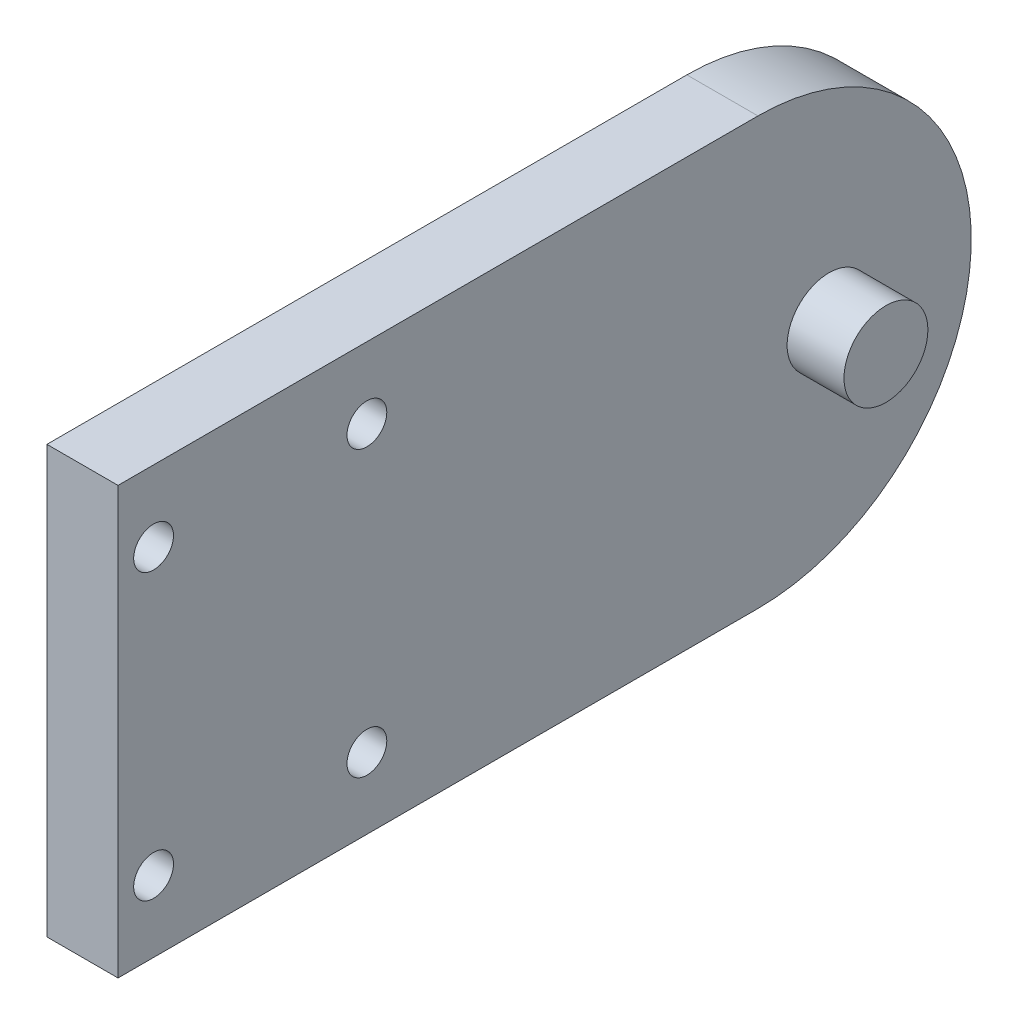
ISO-10303-21;
HEADER;
FILE_DESCRIPTION(('STEP AP214'),'2;1');
FILE_NAME('part.step','',(''),(''),'','','');
FILE_SCHEMA(('AUTOMOTIVE_DESIGN { 1 0 10303 214 1 1 1 1 }'));
ENDSEC;
DATA;
#1=APPLICATION_CONTEXT('core data for automotive mechanical design processes');
#2=APPLICATION_PROTOCOL_DEFINITION('international standard','automotive_design',2000,#1);
#3=PRODUCT_CONTEXT('',#1,'mechanical');
#4=PRODUCT('Part','Part','',(#3));
#5=PRODUCT_RELATED_PRODUCT_CATEGORY('part','',(#4));
#6=PRODUCT_DEFINITION_FORMATION('','',#4);
#7=PRODUCT_DEFINITION_CONTEXT('part definition',#1,'design');
#8=PRODUCT_DEFINITION('design','',#6,#7);
#9=PRODUCT_DEFINITION_SHAPE('','',#8);
#10=(LENGTH_UNIT() NAMED_UNIT(*) SI_UNIT(.MILLI.,.METRE.));
#11=(NAMED_UNIT(*) PLANE_ANGLE_UNIT() SI_UNIT($,.RADIAN.));
#12=(NAMED_UNIT(*) SI_UNIT($,.STERADIAN.) SOLID_ANGLE_UNIT());
#13=UNCERTAINTY_MEASURE_WITH_UNIT(LENGTH_MEASURE(1.E-05),#10,'distance_accuracy_value','');
#14=(GEOMETRIC_REPRESENTATION_CONTEXT(3) GLOBAL_UNCERTAINTY_ASSIGNED_CONTEXT((#13)) GLOBAL_UNIT_ASSIGNED_CONTEXT((#10,
#11,#12)) REPRESENTATION_CONTEXT('',''));
#15=CARTESIAN_POINT('',(0.,0.,0.));
#16=DIRECTION('',(0.,0.,1.));
#17=DIRECTION('',(1.,0.,0.));
#18=AXIS2_PLACEMENT_3D('',#15,#16,#17);
#19=CARTESIAN_POINT('',(0.,30.,0.));
#20=DIRECTION('',(0.,1.,0.));
#21=DIRECTION('',(0.,0.,-1.));
#22=AXIS2_PLACEMENT_3D('',#19,#20,#21);
#23=PLANE('',#22);
#24=DIRECTION('',(0.,0.,-1.));
#25=VECTOR('',#24,1.);
#26=CARTESIAN_POINT('',(-2.5,30.,30.));
#27=LINE('',#26,#25);
#28=CARTESIAN_POINT('',(-2.5,30.,30.));
#29=VERTEX_POINT('',#28);
#30=CARTESIAN_POINT('',(-2.5,30.,-15.));
#31=VERTEX_POINT('',#30);
#32=EDGE_CURVE('E85',#29,#31,#27,.T.);
#33=ORIENTED_EDGE('',*,*,#32,.F.);
#34=DIRECTION('',(-1.,0.,0.));
#35=VECTOR('',#34,1.);
#36=CARTESIAN_POINT('',(-2.5,30.,30.));
#37=LINE('',#36,#35);
#38=CARTESIAN_POINT('',(2.5,30.,30.));
#39=VERTEX_POINT('',#38);
#40=EDGE_CURVE('E89',#39,#29,#37,.T.);
#41=ORIENTED_EDGE('',*,*,#40,.F.);
#42=DIRECTION('',(0.,0.,1.));
#43=VECTOR('',#42,1.);
#44=CARTESIAN_POINT('',(2.5,30.,30.));
#45=LINE('',#44,#43);
#46=CARTESIAN_POINT('',(2.5,30.,-15.));
#47=VERTEX_POINT('',#46);
#48=EDGE_CURVE('E188',#47,#39,#45,.T.);
#49=ORIENTED_EDGE('',*,*,#48,.F.);
#50=DIRECTION('',(-1.,0.,0.));
#51=VECTOR('',#50,1.);
#52=CARTESIAN_POINT('',(7.5,30.,-15.));
#53=LINE('',#52,#51);
#54=EDGE_CURVE('E11',#31,#47,#53,.F.);
#55=ORIENTED_EDGE('',*,*,#54,.F.);
#56=EDGE_LOOP('',(#33,#41,#49,#55));
#57=FACE_BOUND('',#56,.T.);
#58=ADVANCED_FACE('F41',(#57),#23,.T.);
#59=CARTESIAN_POINT('',(-2.5,30.,30.));
#60=DIRECTION('',(1.,0.,0.));
#61=DIRECTION('',(0.,0.,1.));
#62=AXIS2_PLACEMENT_3D('',#59,#60,#61);
#63=PLANE('',#62);
#64=CARTESIAN_POINT('',(-2.5,25.,27.5));
#65=DIRECTION('',(1.,0.,0.));
#66=DIRECTION('',(0.,0.,-1.));
#67=AXIS2_PLACEMENT_3D('',#64,#65,#66);
#68=CIRCLE('',#67,1.4);
#69=CARTESIAN_POINT('',(-2.5,25.,26.1));
#70=VERTEX_POINT('',#69);
#71=EDGE_CURVE('E109',#70,#70,#68,.T.);
#72=ORIENTED_EDGE('',*,*,#71,.T.);
#73=EDGE_LOOP('',(#72));
#74=FACE_BOUND('',#73,.T.);
#75=CARTESIAN_POINT('',(-2.5,25.,12.5));
#76=DIRECTION('',(1.,0.,0.));
#77=DIRECTION('',(0.,0.,-1.));
#78=AXIS2_PLACEMENT_3D('',#75,#76,#77);
#79=CIRCLE('',#78,1.4);
#80=CARTESIAN_POINT('',(-2.5,25.,11.1));
#81=VERTEX_POINT('',#80);
#82=EDGE_CURVE('E176',#81,#81,#79,.T.);
#83=ORIENTED_EDGE('',*,*,#82,.T.);
#84=EDGE_LOOP('',(#83));
#85=FACE_BOUND('',#84,.T.);
#86=CARTESIAN_POINT('',(-2.5,5.,12.5));
#87=DIRECTION('',(1.,0.,0.));
#88=DIRECTION('',(0.,0.,1.));
#89=AXIS2_PLACEMENT_3D('',#86,#87,#88);
#90=CIRCLE('',#89,1.4);
#91=CARTESIAN_POINT('',(-2.5,5.,13.9));
#92=VERTEX_POINT('',#91);
#93=EDGE_CURVE('E174',#92,#92,#90,.T.);
#94=ORIENTED_EDGE('',*,*,#93,.T.);
#95=EDGE_LOOP('',(#94));
#96=FACE_BOUND('',#95,.T.);
#97=CARTESIAN_POINT('',(-2.5,5.,27.5));
#98=DIRECTION('',(1.,0.,0.));
#99=DIRECTION('',(0.,0.,1.));
#100=AXIS2_PLACEMENT_3D('',#97,#98,#99);
#101=CIRCLE('',#100,1.4);
#102=CARTESIAN_POINT('',(-2.5,5.,28.9));
#103=VERTEX_POINT('',#102);
#104=EDGE_CURVE('E177',#103,#103,#101,.T.);
#105=ORIENTED_EDGE('',*,*,#104,.T.);
#106=EDGE_LOOP('',(#105));
#107=FACE_BOUND('',#106,.T.);
#108=CARTESIAN_POINT('',(-2.5,15.,-15.));
#109=DIRECTION('',(1.,0.,0.));
#110=DIRECTION('',(0.,0.,-1.));
#111=AXIS2_PLACEMENT_3D('',#108,#109,#110);
#112=CIRCLE('',#111,15.);
#113=CARTESIAN_POINT('',(-2.5,0.,-15.));
#114=VERTEX_POINT('',#113);
#115=EDGE_CURVE('E93',#114,#31,#112,.T.);
#116=ORIENTED_EDGE('',*,*,#115,.F.);
#117=DIRECTION('',(0.,0.,-1.));
#118=VECTOR('',#117,1.);
#119=CARTESIAN_POINT('',(-2.5,0.,30.));
#120=LINE('',#119,#118);
#121=CARTESIAN_POINT('',(-2.5,0.,30.));
#122=VERTEX_POINT('',#121);
#123=EDGE_CURVE('E79',#122,#114,#120,.T.);
#124=ORIENTED_EDGE('',*,*,#123,.F.);
#125=DIRECTION('',(0.,-1.,0.));
#126=VECTOR('',#125,1.);
#127=CARTESIAN_POINT('',(-2.5,30.,30.));
#128=LINE('',#127,#126);
#129=EDGE_CURVE('E64',#29,#122,#128,.T.);
#130=ORIENTED_EDGE('',*,*,#129,.F.);
#131=ORIENTED_EDGE('',*,*,#32,.T.);
#132=EDGE_LOOP('',(#116,#124,#130,#131));
#133=FACE_BOUND('',#132,.T.);
#134=ADVANCED_FACE('F43',(#74,#85,#96,#107,#133),#63,.F.);
#135=CARTESIAN_POINT('',(2.5,30.,30.));
#136=DIRECTION('',(-1.,0.,0.));
#137=DIRECTION('',(0.,0.,-1.));
#138=AXIS2_PLACEMENT_3D('',#135,#136,#137);
#139=PLANE('',#138);
#140=CARTESIAN_POINT('',(2.5,25.,27.5));
#141=DIRECTION('',(1.,0.,0.));
#142=DIRECTION('',(0.,0.,-1.));
#143=AXIS2_PLACEMENT_3D('',#140,#141,#142);
#144=CIRCLE('',#143,1.4);
#145=CARTESIAN_POINT('',(2.5,25.,26.1));
#146=VERTEX_POINT('',#145);
#147=EDGE_CURVE('E105',#146,#146,#144,.T.);
#148=ORIENTED_EDGE('',*,*,#147,.F.);
#149=EDGE_LOOP('',(#148));
#150=FACE_BOUND('',#149,.T.);
#151=CARTESIAN_POINT('',(2.5,25.,12.5));
#152=DIRECTION('',(1.,0.,0.));
#153=DIRECTION('',(0.,0.,-1.));
#154=AXIS2_PLACEMENT_3D('',#151,#152,#153);
#155=CIRCLE('',#154,1.4);
#156=CARTESIAN_POINT('',(2.5,25.,11.1));
#157=VERTEX_POINT('',#156);
#158=EDGE_CURVE('E108',#157,#157,#155,.T.);
#159=ORIENTED_EDGE('',*,*,#158,.F.);
#160=EDGE_LOOP('',(#159));
#161=FACE_BOUND('',#160,.T.);
#162=CARTESIAN_POINT('',(2.5,5.,12.5));
#163=DIRECTION('',(1.,0.,0.));
#164=DIRECTION('',(0.,0.,-1.));
#165=AXIS2_PLACEMENT_3D('',#162,#163,#164);
#166=CIRCLE('',#165,1.4);
#167=CARTESIAN_POINT('',(2.5,5.,11.1));
#168=VERTEX_POINT('',#167);
#169=EDGE_CURVE('E98',#168,#168,#166,.T.);
#170=ORIENTED_EDGE('',*,*,#169,.F.);
#171=EDGE_LOOP('',(#170));
#172=FACE_BOUND('',#171,.T.);
#173=CARTESIAN_POINT('',(2.5,5.,27.5));
#174=DIRECTION('',(1.,0.,0.));
#175=DIRECTION('',(0.,0.,-1.));
#176=AXIS2_PLACEMENT_3D('',#173,#174,#175);
#177=CIRCLE('',#176,1.4);
#178=CARTESIAN_POINT('',(2.5,5.,26.1));
#179=VERTEX_POINT('',#178);
#180=EDGE_CURVE('E94',#179,#179,#177,.T.);
#181=ORIENTED_EDGE('',*,*,#180,.F.);
#182=EDGE_LOOP('',(#181));
#183=FACE_BOUND('',#182,.T.);
#184=CARTESIAN_POINT('',(2.5,15.,-20.));
#185=DIRECTION('',(1.,0.,0.));
#186=DIRECTION('',(0.,0.,-1.));
#187=AXIS2_PLACEMENT_3D('',#184,#185,#186);
#188=CIRCLE('',#187,2.95);
#189=CARTESIAN_POINT('',(2.5,15.,-22.95));
#190=VERTEX_POINT('',#189);
#191=EDGE_CURVE('E104',#190,#190,#188,.F.);
#192=ORIENTED_EDGE('',*,*,#191,.T.);
#193=EDGE_LOOP('',(#192));
#194=FACE_BOUND('',#193,.T.);
#195=ORIENTED_EDGE('',*,*,#48,.T.);
#196=DIRECTION('',(0.,-1.,0.));
#197=VECTOR('',#196,1.);
#198=CARTESIAN_POINT('',(2.5,30.,30.));
#199=LINE('',#198,#197);
#200=CARTESIAN_POINT('',(2.5,0.,30.));
#201=VERTEX_POINT('',#200);
#202=EDGE_CURVE('E91',#39,#201,#199,.T.);
#203=ORIENTED_EDGE('',*,*,#202,.T.);
#204=DIRECTION('',(0.,0.,1.));
#205=VECTOR('',#204,1.);
#206=CARTESIAN_POINT('',(2.5,0.,30.));
#207=LINE('',#206,#205);
#208=CARTESIAN_POINT('',(2.5,0.,-15.));
#209=VERTEX_POINT('',#208);
#210=EDGE_CURVE('E82',#209,#201,#207,.T.);
#211=ORIENTED_EDGE('',*,*,#210,.F.);
#212=CARTESIAN_POINT('',(2.5,15.,-15.));
#213=DIRECTION('',(1.,0.,0.));
#214=DIRECTION('',(0.,0.,-1.));
#215=AXIS2_PLACEMENT_3D('',#212,#213,#214);
#216=CIRCLE('',#215,15.);
#217=EDGE_CURVE('E193',#209,#47,#216,.T.);
#218=ORIENTED_EDGE('',*,*,#217,.T.);
#219=EDGE_LOOP('',(#195,#203,#211,#218));
#220=FACE_BOUND('',#219,.T.);
#221=ADVANCED_FACE('F117',(#150,#161,#172,#183,#194,#220),#139,.F.);
#222=CARTESIAN_POINT('',(-2.5,30.,30.));
#223=DIRECTION('',(0.,0.,-1.));
#224=DIRECTION('',(1.,0.,0.));
#225=AXIS2_PLACEMENT_3D('',#222,#223,#224);
#226=PLANE('',#225);
#227=DIRECTION('',(-1.,0.,0.));
#228=VECTOR('',#227,1.);
#229=CARTESIAN_POINT('',(-2.5,0.,30.));
#230=LINE('',#229,#228);
#231=EDGE_CURVE('E77',#201,#122,#230,.T.);
#232=ORIENTED_EDGE('',*,*,#231,.F.);
#233=ORIENTED_EDGE('',*,*,#202,.F.);
#234=ORIENTED_EDGE('',*,*,#40,.T.);
#235=ORIENTED_EDGE('',*,*,#129,.T.);
#236=EDGE_LOOP('',(#232,#233,#234,#235));
#237=FACE_BOUND('',#236,.T.);
#238=ADVANCED_FACE('F87',(#237),#226,.F.);
#239=CARTESIAN_POINT('',(0.,0.,0.));
#240=DIRECTION('',(0.,1.,0.));
#241=DIRECTION('',(0.,0.,-1.));
#242=AXIS2_PLACEMENT_3D('',#239,#240,#241);
#243=PLANE('',#242);
#244=ORIENTED_EDGE('',*,*,#210,.T.);
#245=ORIENTED_EDGE('',*,*,#231,.T.);
#246=ORIENTED_EDGE('',*,*,#123,.T.);
#247=DIRECTION('',(-1.,0.,0.));
#248=VECTOR('',#247,1.);
#249=CARTESIAN_POINT('',(7.5,0.,-15.));
#250=LINE('',#249,#248);
#251=EDGE_CURVE('E49',#209,#114,#250,.T.);
#252=ORIENTED_EDGE('',*,*,#251,.F.);
#253=EDGE_LOOP('',(#244,#245,#246,#252));
#254=FACE_BOUND('',#253,.T.);
#255=ADVANCED_FACE('F78',(#254),#243,.F.);
#256=CARTESIAN_POINT('',(3.5,25.,27.5));
#257=DIRECTION('',(-1.,0.,0.));
#258=DIRECTION('',(0.,0.,-1.));
#259=AXIS2_PLACEMENT_3D('',#256,#257,#258);
#260=CYLINDRICAL_SURFACE('',#259,1.4);
#261=ORIENTED_EDGE('',*,*,#71,.F.);
#262=EDGE_LOOP('',(#261));
#263=FACE_BOUND('',#262,.T.);
#264=ORIENTED_EDGE('',*,*,#147,.T.);
#265=EDGE_LOOP('',(#264));
#266=FACE_BOUND('',#265,.T.);
#267=ADVANCED_FACE('F147',(#263,#266),#260,.F.);
#268=CARTESIAN_POINT('',(3.5,25.,12.5));
#269=DIRECTION('',(-1.,0.,0.));
#270=DIRECTION('',(0.,0.,-1.));
#271=AXIS2_PLACEMENT_3D('',#268,#269,#270);
#272=CYLINDRICAL_SURFACE('',#271,1.4);
#273=ORIENTED_EDGE('',*,*,#82,.F.);
#274=EDGE_LOOP('',(#273));
#275=FACE_BOUND('',#274,.T.);
#276=ORIENTED_EDGE('',*,*,#158,.T.);
#277=EDGE_LOOP('',(#276));
#278=FACE_BOUND('',#277,.T.);
#279=ADVANCED_FACE('F165',(#275,#278),#272,.F.);
#280=CARTESIAN_POINT('',(3.5,5.,12.5));
#281=DIRECTION('',(-1.,0.,0.));
#282=DIRECTION('',(0.,0.,-1.));
#283=AXIS2_PLACEMENT_3D('',#280,#281,#282);
#284=CYLINDRICAL_SURFACE('',#283,1.4);
#285=ORIENTED_EDGE('',*,*,#93,.F.);
#286=EDGE_LOOP('',(#285));
#287=FACE_BOUND('',#286,.T.);
#288=ORIENTED_EDGE('',*,*,#169,.T.);
#289=EDGE_LOOP('',(#288));
#290=FACE_BOUND('',#289,.T.);
#291=ADVANCED_FACE('F133',(#287,#290),#284,.F.);
#292=CARTESIAN_POINT('',(3.5,5.,27.5));
#293=DIRECTION('',(-1.,0.,0.));
#294=DIRECTION('',(0.,0.,-1.));
#295=AXIS2_PLACEMENT_3D('',#292,#293,#294);
#296=CYLINDRICAL_SURFACE('',#295,1.4);
#297=ORIENTED_EDGE('',*,*,#104,.F.);
#298=EDGE_LOOP('',(#297));
#299=FACE_BOUND('',#298,.T.);
#300=ORIENTED_EDGE('',*,*,#180,.T.);
#301=EDGE_LOOP('',(#300));
#302=FACE_BOUND('',#301,.T.);
#303=ADVANCED_FACE('F123',(#299,#302),#296,.F.);
#304=CARTESIAN_POINT('',(6.5,15.,-20.));
#305=DIRECTION('',(-1.,0.,0.));
#306=DIRECTION('',(0.,0.,-1.));
#307=AXIS2_PLACEMENT_3D('',#304,#305,#306);
#308=CYLINDRICAL_SURFACE('',#307,2.95);
#309=CARTESIAN_POINT('',(6.5,15.,-20.));
#310=DIRECTION('',(-1.,0.,0.));
#311=DIRECTION('',(0.,0.,1.));
#312=AXIS2_PLACEMENT_3D('',#309,#310,#311);
#313=CIRCLE('',#312,2.95);
#314=CARTESIAN_POINT('',(6.5,15.,-17.05));
#315=VERTEX_POINT('',#314);
#316=EDGE_CURVE('E182',#315,#315,#313,.T.);
#317=ORIENTED_EDGE('',*,*,#316,.T.);
#318=EDGE_LOOP('',(#317));
#319=FACE_BOUND('',#318,.T.);
#320=ORIENTED_EDGE('',*,*,#191,.F.);
#321=EDGE_LOOP('',(#320));
#322=FACE_BOUND('',#321,.T.);
#323=ADVANCED_FACE('F120',(#319,#322),#308,.T.);
#324=CARTESIAN_POINT('',(6.5,15.,-20.));
#325=DIRECTION('',(1.,0.,0.));
#326=DIRECTION('',(0.,0.,1.));
#327=AXIS2_PLACEMENT_3D('',#324,#325,#326);
#328=PLANE('',#327);
#329=ORIENTED_EDGE('',*,*,#316,.F.);
#330=EDGE_LOOP('',(#329));
#331=FACE_BOUND('',#330,.T.);
#332=ADVANCED_FACE('F122',(#331),#328,.T.);
#333=CARTESIAN_POINT('',(7.5,15.,-15.));
#334=DIRECTION('',(-1.,0.,0.));
#335=DIRECTION('',(0.,0.,-1.));
#336=AXIS2_PLACEMENT_3D('',#333,#334,#335);
#337=CYLINDRICAL_SURFACE('',#336,15.);
#338=ORIENTED_EDGE('',*,*,#217,.F.);
#339=ORIENTED_EDGE('',*,*,#251,.T.);
#340=ORIENTED_EDGE('',*,*,#115,.T.);
#341=ORIENTED_EDGE('',*,*,#54,.T.);
#342=EDGE_LOOP('',(#338,#339,#340,#341));
#343=FACE_BOUND('',#342,.T.);
#344=ADVANCED_FACE('F130',(#343),#337,.T.);
#345=CLOSED_SHELL('',(#58,#134,#221,#238,#255,#267,#279,#291,#303,#323,#332,#344));
#346=MANIFOLD_SOLID_BREP('B2',#345);
#347=ADVANCED_BREP_SHAPE_REPRESENTATION('',(#18,#346),#14);
#348=SHAPE_DEFINITION_REPRESENTATION(#9,#347);
ENDSEC;
END-ISO-10303-21;
